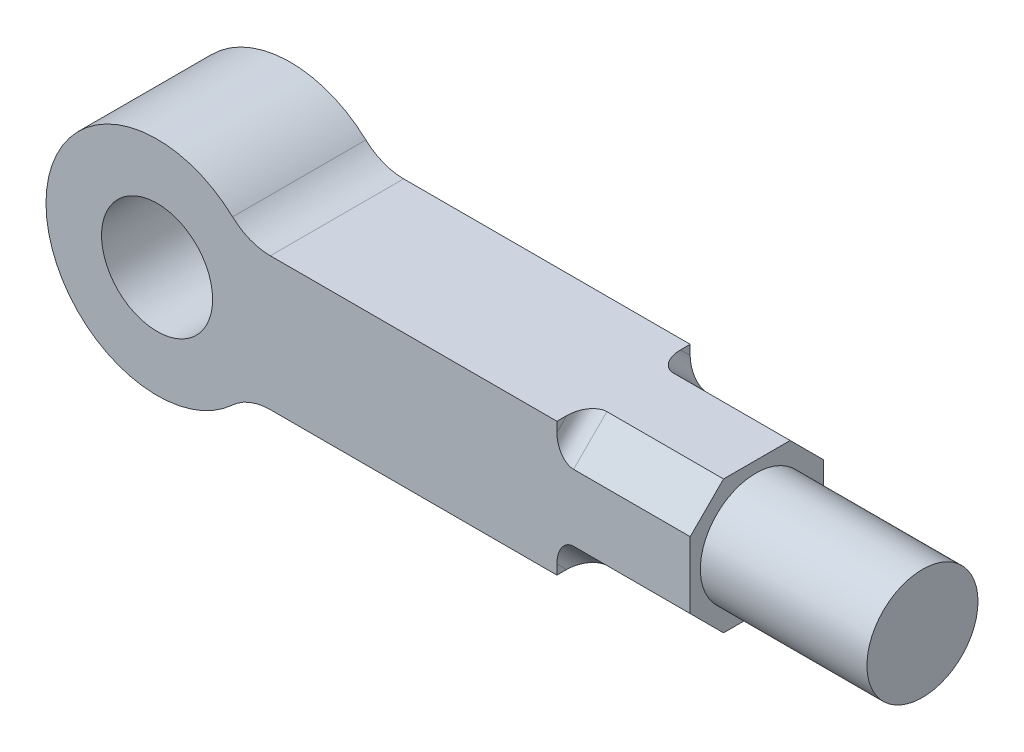
ISO-10303-21;
HEADER;
FILE_DESCRIPTION(('STEP AP214'),'2;1');
FILE_NAME('part.step','',(''),(''),'','','');
FILE_SCHEMA(('AUTOMOTIVE_DESIGN { 1 0 10303 214 1 1 1 1 }'));
ENDSEC;
DATA;
#1=APPLICATION_CONTEXT('core data for automotive mechanical design processes');
#2=APPLICATION_PROTOCOL_DEFINITION('international standard','automotive_design',2000,#1);
#3=PRODUCT_CONTEXT('',#1,'mechanical');
#4=PRODUCT('Part','Part','',(#3));
#5=PRODUCT_RELATED_PRODUCT_CATEGORY('part','',(#4));
#6=PRODUCT_DEFINITION_FORMATION('','',#4);
#7=PRODUCT_DEFINITION_CONTEXT('part definition',#1,'design');
#8=PRODUCT_DEFINITION('design','',#6,#7);
#9=PRODUCT_DEFINITION_SHAPE('','',#8);
#10=(LENGTH_UNIT() NAMED_UNIT(*) SI_UNIT(.MILLI.,.METRE.));
#11=(NAMED_UNIT(*) PLANE_ANGLE_UNIT() SI_UNIT($,.RADIAN.));
#12=(NAMED_UNIT(*) SI_UNIT($,.STERADIAN.) SOLID_ANGLE_UNIT());
#13=UNCERTAINTY_MEASURE_WITH_UNIT(LENGTH_MEASURE(1.E-05),#10,'distance_accuracy_value','');
#14=(GEOMETRIC_REPRESENTATION_CONTEXT(3) GLOBAL_UNCERTAINTY_ASSIGNED_CONTEXT((#13)) GLOBAL_UNIT_ASSIGNED_CONTEXT((#10,
#11,#12)) REPRESENTATION_CONTEXT('',''));
#15=CARTESIAN_POINT('',(0.,0.,0.));
#16=DIRECTION('',(0.,0.,1.));
#17=DIRECTION('',(1.,0.,0.));
#18=AXIS2_PLACEMENT_3D('',#15,#16,#17);
#19=CARTESIAN_POINT('',(20.3960780543711,-22.,0.));
#20=DIRECTION('',(0.,0.,-1.));
#21=DIRECTION('',(-1.,0.,0.));
#22=AXIS2_PLACEMENT_3D('',#19,#20,#21);
#23=PLANE('',#22);
#24=DIRECTION('',(0.,1.,0.));
#25=VECTOR('',#24,1.);
#26=CARTESIAN_POINT('',(72.,0.,0.));
#27=LINE('',#26,#25);
#28=CARTESIAN_POINT('',(72.,10.2426406871193,0.));
#29=VERTEX_POINT('',#28);
#30=CARTESIAN_POINT('',(72.,12.,0.));
#31=VERTEX_POINT('',#30);
#32=EDGE_CURVE('E360',#29,#31,#27,.T.);
#33=ORIENTED_EDGE('',*,*,#32,.F.);
#34=CARTESIAN_POINT('',(75.,10.2426406871193,0.));
#35=DIRECTION('',(0.,0.,-1.));
#36=DIRECTION('',(0.,-1.,0.));
#37=AXIS2_PLACEMENT_3D('',#34,#35,#36);
#38=ELLIPSE('',#37,4.24264068711928,3.);
#39=CARTESIAN_POINT('',(75.,6.00000000000001,0.));
#40=VERTEX_POINT('',#39);
#41=EDGE_CURVE('E56',#29,#40,#38,.F.);
#42=ORIENTED_EDGE('',*,*,#41,.T.);
#43=DIRECTION('',(1.,0.,0.));
#44=VECTOR('',#43,1.);
#45=CARTESIAN_POINT('',(72.,6.00000000000001,0.));
#46=LINE('',#45,#44);
#47=CARTESIAN_POINT('',(96.,6.00000000000001,0.));
#48=VERTEX_POINT('',#47);
#49=EDGE_CURVE('E383',#40,#48,#46,.T.);
#50=ORIENTED_EDGE('',*,*,#49,.T.);
#51=DIRECTION('',(0.,1.,0.));
#52=VECTOR('',#51,1.);
#53=CARTESIAN_POINT('',(96.,12.,0.));
#54=LINE('',#53,#52);
#55=CARTESIAN_POINT('',(96.,-6.00000000000001,0.));
#56=VERTEX_POINT('',#55);
#57=EDGE_CURVE('E331',#56,#48,#54,.T.);
#58=ORIENTED_EDGE('',*,*,#57,.F.);
#59=DIRECTION('',(1.,0.,0.));
#60=VECTOR('',#59,1.);
#61=CARTESIAN_POINT('',(72.,-6.00000000000001,0.));
#62=LINE('',#61,#60);
#63=CARTESIAN_POINT('',(75.,-6.00000000000001,0.));
#64=VERTEX_POINT('',#63);
#65=EDGE_CURVE('E401',#64,#56,#62,.T.);
#66=ORIENTED_EDGE('',*,*,#65,.F.);
#67=CARTESIAN_POINT('',(75.,-10.3881066520916,0.));
#68=DIRECTION('',(0.,0.,-1.));
#69=DIRECTION('',(0.,-1.,0.));
#70=AXIS2_PLACEMENT_3D('',#67,#68,#69);
#71=ELLIPSE('',#70,4.38810665209159,3.);
#72=CARTESIAN_POINT('',(72.,-10.3881066520916,0.));
#73=VERTEX_POINT('',#72);
#74=EDGE_CURVE('E188',#64,#73,#71,.F.);
#75=ORIENTED_EDGE('',*,*,#74,.T.);
#76=DIRECTION('',(0.,1.,0.));
#77=VECTOR('',#76,1.);
#78=CARTESIAN_POINT('',(72.,0.,0.));
#79=LINE('',#78,#77);
#80=CARTESIAN_POINT('',(72.,-12.,0.));
#81=VERTEX_POINT('',#80);
#82=EDGE_CURVE('E174',#81,#73,#79,.T.);
#83=ORIENTED_EDGE('',*,*,#82,.F.);
#84=DIRECTION('',(1.,0.,0.));
#85=VECTOR('',#84,1.);
#86=CARTESIAN_POINT('',(20.3960780543711,-12.,0.));
#87=LINE('',#86,#85);
#88=CARTESIAN_POINT('',(20.3960780543711,-12.,0.));
#89=VERTEX_POINT('',#88);
#90=EDGE_CURVE('E186',#89,#81,#87,.T.);
#91=ORIENTED_EDGE('',*,*,#90,.F.);
#92=CARTESIAN_POINT('',(20.3960780543711,-22.,0.));
#93=DIRECTION('',(0.,0.,-1.));
#94=DIRECTION('',(-1.,0.,0.));
#95=AXIS2_PLACEMENT_3D('',#92,#93,#94);
#96=CIRCLE('',#95,10.);
#97=CARTESIAN_POINT('',(13.5973853695808,-14.6666666666667,0.));
#98=VERTEX_POINT('',#97);
#99=EDGE_CURVE('E200',#98,#89,#96,.T.);
#100=ORIENTED_EDGE('',*,*,#99,.F.);
#101=CARTESIAN_POINT('',(0.,0.,0.));
#102=DIRECTION('',(0.,0.,1.));
#103=DIRECTION('',(1.,0.,0.));
#104=AXIS2_PLACEMENT_3D('',#101,#102,#103);
#105=CIRCLE('',#104,20.);
#106=CARTESIAN_POINT('',(13.5973853695807,14.6666666666667,0.));
#107=VERTEX_POINT('',#106);
#108=EDGE_CURVE('E208',#107,#98,#105,.T.);
#109=ORIENTED_EDGE('',*,*,#108,.F.);
#110=CARTESIAN_POINT('',(20.3960780543711,22.,0.));
#111=DIRECTION('',(0.,0.,-1.));
#112=DIRECTION('',(-1.,0.,0.));
#113=AXIS2_PLACEMENT_3D('',#110,#111,#112);
#114=CIRCLE('',#113,10.);
#115=CARTESIAN_POINT('',(20.3960780543711,12.,0.));
#116=VERTEX_POINT('',#115);
#117=EDGE_CURVE('E339',#116,#107,#114,.T.);
#118=ORIENTED_EDGE('',*,*,#117,.F.);
#119=DIRECTION('',(-1.,0.,0.));
#120=VECTOR('',#119,1.);
#121=CARTESIAN_POINT('',(20.3960780543711,12.,0.));
#122=LINE('',#121,#120);
#123=EDGE_CURVE('E335',#31,#116,#122,.T.);
#124=ORIENTED_EDGE('',*,*,#123,.F.);
#125=EDGE_LOOP('',(#33,#42,#50,#58,#66,#75,#83,#91,#100,#109,#118,#124));
#126=FACE_BOUND('',#125,.T.);
#127=CARTESIAN_POINT('',(0.,0.,0.));
#128=DIRECTION('',(0.,0.,1.));
#129=DIRECTION('',(1.,0.,0.));
#130=AXIS2_PLACEMENT_3D('',#127,#128,#129);
#131=CIRCLE('',#130,10.);
#132=CARTESIAN_POINT('',(10.,0.,0.));
#133=VERTEX_POINT('',#132);
#134=EDGE_CURVE('E420',#133,#133,#131,.T.);
#135=ORIENTED_EDGE('',*,*,#134,.T.);
#136=EDGE_LOOP('',(#135));
#137=FACE_BOUND('',#136,.T.);
#138=ADVANCED_FACE('F47',(#126,#137),#23,.T.);
#139=CARTESIAN_POINT('',(96.,12.,24.));
#140=DIRECTION('',(-1.,0.,0.));
#141=DIRECTION('',(0.,0.,1.));
#142=AXIS2_PLACEMENT_3D('',#139,#140,#141);
#143=PLANE('',#142);
#144=CARTESIAN_POINT('',(96.,0.,12.1791365862407));
#145=DIRECTION('',(1.,0.,0.));
#146=DIRECTION('',(0.,0.,-1.));
#147=AXIS2_PLACEMENT_3D('',#144,#145,#146);
#148=CIRCLE('',#147,10.);
#149=CARTESIAN_POINT('',(96.,0.,2.1791365862407));
#150=VERTEX_POINT('',#149);
#151=EDGE_CURVE('E235',#150,#150,#148,.T.);
#152=ORIENTED_EDGE('',*,*,#151,.F.);
#153=EDGE_LOOP('',(#152));
#154=FACE_BOUND('',#153,.T.);
#155=ORIENTED_EDGE('',*,*,#57,.T.);
#156=DIRECTION('',(0.,-0.707106781186548,-0.707106781186548));
#157=VECTOR('',#156,1.);
#158=CARTESIAN_POINT('',(96.,3.,-3.));
#159=LINE('',#158,#157);
#160=CARTESIAN_POINT('',(96.,12.,6.00000000000001));
#161=VERTEX_POINT('',#160);
#162=EDGE_CURVE('E370',#161,#48,#159,.T.);
#163=ORIENTED_EDGE('',*,*,#162,.F.);
#164=DIRECTION('',(0.,0.,-1.));
#165=VECTOR('',#164,1.);
#166=CARTESIAN_POINT('',(96.,12.,24.));
#167=LINE('',#166,#165);
#168=CARTESIAN_POINT('',(96.,12.,18.));
#169=VERTEX_POINT('',#168);
#170=EDGE_CURVE('E231',#169,#161,#167,.T.);
#171=ORIENTED_EDGE('',*,*,#170,.F.);
#172=DIRECTION('',(0.,0.707106781186548,-0.707106781186547));
#173=VECTOR('',#172,1.);
#174=CARTESIAN_POINT('',(96.,15.,15.));
#175=LINE('',#174,#173);
#176=CARTESIAN_POINT('',(96.,6.00000000000001,24.));
#177=VERTEX_POINT('',#176);
#178=EDGE_CURVE('E386',#177,#169,#175,.T.);
#179=ORIENTED_EDGE('',*,*,#178,.F.);
#180=DIRECTION('',(0.,1.,0.));
#181=VECTOR('',#180,1.);
#182=CARTESIAN_POINT('',(96.,12.,24.));
#183=LINE('',#182,#181);
#184=CARTESIAN_POINT('',(96.,-6.00000000000001,24.));
#185=VERTEX_POINT('',#184);
#186=EDGE_CURVE('E199',#185,#177,#183,.T.);
#187=ORIENTED_EDGE('',*,*,#186,.F.);
#188=DIRECTION('',(0.,0.707106781186547,0.707106781186548));
#189=VECTOR('',#188,1.);
#190=CARTESIAN_POINT('',(96.,-15.,15.));
#191=LINE('',#190,#189);
#192=CARTESIAN_POINT('',(96.,-12.,18.));
#193=VERTEX_POINT('',#192);
#194=EDGE_CURVE('E394',#193,#185,#191,.T.);
#195=ORIENTED_EDGE('',*,*,#194,.F.);
#196=DIRECTION('',(0.,0.,-1.));
#197=VECTOR('',#196,1.);
#198=CARTESIAN_POINT('',(96.,-12.,24.));
#199=LINE('',#198,#197);
#200=CARTESIAN_POINT('',(96.,-12.,5.62075310819665));
#201=VERTEX_POINT('',#200);
#202=EDGE_CURVE('E212',#193,#201,#199,.T.);
#203=ORIENTED_EDGE('',*,*,#202,.T.);
#204=DIRECTION('',(0.,0.729794895369163,-0.683666154415379));
#205=VECTOR('',#204,1.);
#206=CARTESIAN_POINT('',(96.,-2.80439646415868,-2.99361641777407));
#207=LINE('',#206,#205);
#208=EDGE_CURVE('E181',#201,#56,#207,.T.);
#209=ORIENTED_EDGE('',*,*,#208,.T.);
#210=EDGE_LOOP('',(#155,#163,#171,#179,#187,#195,#203,#209));
#211=FACE_BOUND('',#210,.T.);
#212=ADVANCED_FACE('F445',(#154,#211),#143,.F.);
#213=CARTESIAN_POINT('',(20.3960780543711,-12.,24.));
#214=DIRECTION('',(0.,1.,0.));
#215=DIRECTION('',(0.,0.,1.));
#216=AXIS2_PLACEMENT_3D('',#213,#214,#215);
#217=PLANE('',#216);
#218=ORIENTED_EDGE('',*,*,#202,.F.);
#219=DIRECTION('',(1.,0.,0.));
#220=VECTOR('',#219,1.);
#221=CARTESIAN_POINT('',(72.,-12.,18.));
#222=LINE('',#221,#220);
#223=CARTESIAN_POINT('',(75.,-12.,18.));
#224=VERTEX_POINT('',#223);
#225=EDGE_CURVE('E397',#224,#193,#222,.T.);
#226=ORIENTED_EDGE('',*,*,#225,.F.);
#227=CARTESIAN_POINT('',(75.,-12.,22.2426406871193));
#228=DIRECTION('',(0.,1.,0.));
#229=DIRECTION('',(0.,0.,1.));
#230=AXIS2_PLACEMENT_3D('',#227,#228,#229);
#231=ELLIPSE('',#230,4.24264068711929,3.);
#232=CARTESIAN_POINT('',(72.,-12.,22.2426406871193));
#233=VERTEX_POINT('',#232);
#234=EDGE_CURVE('E270',#224,#233,#231,.T.);
#235=ORIENTED_EDGE('',*,*,#234,.T.);
#236=DIRECTION('',(0.,0.,-1.));
#237=VECTOR('',#236,1.);
#238=CARTESIAN_POINT('',(72.,-12.,0.));
#239=LINE('',#238,#237);
#240=CARTESIAN_POINT('',(72.,-12.,24.));
#241=VERTEX_POINT('',#240);
#242=EDGE_CURVE('E389',#241,#233,#239,.T.);
#243=ORIENTED_EDGE('',*,*,#242,.F.);
#244=DIRECTION('',(1.,0.,0.));
#245=VECTOR('',#244,1.);
#246=CARTESIAN_POINT('',(20.3960780543711,-12.,24.));
#247=LINE('',#246,#245);
#248=CARTESIAN_POINT('',(20.3960780543711,-12.,24.));
#249=VERTEX_POINT('',#248);
#250=EDGE_CURVE('E216',#249,#241,#247,.T.);
#251=ORIENTED_EDGE('',*,*,#250,.F.);
#252=DIRECTION('',(0.,0.,-1.));
#253=VECTOR('',#252,1.);
#254=CARTESIAN_POINT('',(20.3960780543711,-12.,24.));
#255=LINE('',#254,#253);
#256=EDGE_CURVE('E197',#249,#89,#255,.T.);
#257=ORIENTED_EDGE('',*,*,#256,.T.);
#258=ORIENTED_EDGE('',*,*,#90,.T.);
#259=DIRECTION('',(0.,0.,-1.));
#260=VECTOR('',#259,1.);
#261=CARTESIAN_POINT('',(72.,-12.,0.));
#262=LINE('',#261,#260);
#263=CARTESIAN_POINT('',(72.,-12.,1.51000909088961));
#264=VERTEX_POINT('',#263);
#265=EDGE_CURVE('E171',#264,#81,#262,.T.);
#266=ORIENTED_EDGE('',*,*,#265,.F.);
#267=CARTESIAN_POINT('',(75.,-12.,1.51000909088961));
#268=DIRECTION('',(0.,1.,0.));
#269=DIRECTION('',(0.,0.,1.));
#270=AXIS2_PLACEMENT_3D('',#267,#268,#269);
#271=ELLIPSE('',#270,4.11074401730704,3.);
#272=CARTESIAN_POINT('',(75.,-12.,5.62075310819665));
#273=VERTEX_POINT('',#272);
#274=EDGE_CURVE('E264',#264,#273,#271,.T.);
#275=ORIENTED_EDGE('',*,*,#274,.T.);
#276=DIRECTION('',(1.,0.,0.));
#277=VECTOR('',#276,1.);
#278=CARTESIAN_POINT('',(72.,-12.,5.62075310819665));
#279=LINE('',#278,#277);
#280=EDGE_CURVE('E190',#273,#201,#279,.T.);
#281=ORIENTED_EDGE('',*,*,#280,.T.);
#282=EDGE_LOOP('',(#218,#226,#235,#243,#251,#257,#258,#266,#275,#281));
#283=FACE_BOUND('',#282,.T.);
#284=ADVANCED_FACE('F194',(#283),#217,.F.);
#285=CARTESIAN_POINT('',(20.3960780543711,-22.,24.));
#286=DIRECTION('',(0.,0.,-1.));
#287=DIRECTION('',(-1.,0.,0.));
#288=AXIS2_PLACEMENT_3D('',#285,#286,#287);
#289=PLANE('',#288);
#290=DIRECTION('',(0.,-1.,0.));
#291=VECTOR('',#290,1.);
#292=CARTESIAN_POINT('',(72.,0.,24.));
#293=LINE('',#292,#291);
#294=CARTESIAN_POINT('',(72.,-10.2426406871193,24.));
#295=VERTEX_POINT('',#294);
#296=EDGE_CURVE('E393',#295,#241,#293,.T.);
#297=ORIENTED_EDGE('',*,*,#296,.F.);
#298=CARTESIAN_POINT('',(75.,-10.2426406871193,24.));
#299=DIRECTION('',(0.,0.,-1.));
#300=DIRECTION('',(0.,1.,0.));
#301=AXIS2_PLACEMENT_3D('',#298,#299,#300);
#302=ELLIPSE('',#301,4.24264068711928,3.);
#303=CARTESIAN_POINT('',(75.,-6.00000000000001,24.));
#304=VERTEX_POINT('',#303);
#305=EDGE_CURVE('E267',#295,#304,#302,.T.);
#306=ORIENTED_EDGE('',*,*,#305,.T.);
#307=DIRECTION('',(1.,0.,0.));
#308=VECTOR('',#307,1.);
#309=CARTESIAN_POINT('',(72.,-6.00000000000001,24.));
#310=LINE('',#309,#308);
#311=EDGE_CURVE('E378',#304,#185,#310,.T.);
#312=ORIENTED_EDGE('',*,*,#311,.T.);
#313=ORIENTED_EDGE('',*,*,#186,.T.);
#314=DIRECTION('',(1.,0.,0.));
#315=VECTOR('',#314,1.);
#316=CARTESIAN_POINT('',(72.,6.00000000000001,24.));
#317=LINE('',#316,#315);
#318=CARTESIAN_POINT('',(75.,6.00000000000001,24.));
#319=VERTEX_POINT('',#318);
#320=EDGE_CURVE('E413',#319,#177,#317,.T.);
#321=ORIENTED_EDGE('',*,*,#320,.F.);
#322=CARTESIAN_POINT('',(75.,10.2426406871193,24.));
#323=DIRECTION('',(0.,0.,-1.));
#324=DIRECTION('',(0.,1.,0.));
#325=AXIS2_PLACEMENT_3D('',#322,#323,#324);
#326=ELLIPSE('',#325,4.24264068711929,3.);
#327=CARTESIAN_POINT('',(72.,10.2426406871193,24.));
#328=VERTEX_POINT('',#327);
#329=EDGE_CURVE('E276',#319,#328,#326,.T.);
#330=ORIENTED_EDGE('',*,*,#329,.T.);
#331=DIRECTION('',(0.,-1.,0.));
#332=VECTOR('',#331,1.);
#333=CARTESIAN_POINT('',(72.,0.,24.));
#334=LINE('',#333,#332);
#335=CARTESIAN_POINT('',(72.,12.,24.));
#336=VERTEX_POINT('',#335);
#337=EDGE_CURVE('E406',#336,#328,#334,.T.);
#338=ORIENTED_EDGE('',*,*,#337,.F.);
#339=DIRECTION('',(-1.,0.,0.));
#340=VECTOR('',#339,1.);
#341=CARTESIAN_POINT('',(20.3960780543711,12.,24.));
#342=LINE('',#341,#340);
#343=CARTESIAN_POINT('',(20.3960780543711,12.,24.));
#344=VERTEX_POINT('',#343);
#345=EDGE_CURVE('E206',#336,#344,#342,.T.);
#346=ORIENTED_EDGE('',*,*,#345,.T.);
#347=CARTESIAN_POINT('',(20.3960780543711,22.,24.));
#348=DIRECTION('',(0.,0.,-1.));
#349=DIRECTION('',(-1.,0.,0.));
#350=AXIS2_PLACEMENT_3D('',#347,#348,#349);
#351=CIRCLE('',#350,10.);
#352=CARTESIAN_POINT('',(13.5973853695807,14.6666666666667,24.));
#353=VERTEX_POINT('',#352);
#354=EDGE_CURVE('E317',#344,#353,#351,.T.);
#355=ORIENTED_EDGE('',*,*,#354,.T.);
#356=CARTESIAN_POINT('',(0.,0.,24.));
#357=DIRECTION('',(0.,0.,1.));
#358=DIRECTION('',(1.,0.,0.));
#359=AXIS2_PLACEMENT_3D('',#356,#357,#358);
#360=CIRCLE('',#359,20.);
#361=CARTESIAN_POINT('',(13.5973853695808,-14.6666666666667,24.));
#362=VERTEX_POINT('',#361);
#363=EDGE_CURVE('E313',#353,#362,#360,.T.);
#364=ORIENTED_EDGE('',*,*,#363,.T.);
#365=CARTESIAN_POINT('',(20.3960780543711,-22.,24.));
#366=DIRECTION('',(0.,0.,-1.));
#367=DIRECTION('',(-1.,0.,0.));
#368=AXIS2_PLACEMENT_3D('',#365,#366,#367);
#369=CIRCLE('',#368,10.);
#370=EDGE_CURVE('E309',#362,#249,#369,.T.);
#371=ORIENTED_EDGE('',*,*,#370,.T.);
#372=ORIENTED_EDGE('',*,*,#250,.T.);
#373=EDGE_LOOP('',(#297,#306,#312,#313,#321,#330,#338,#346,#355,#364,#371,#372));
#374=FACE_BOUND('',#373,.T.);
#375=CARTESIAN_POINT('',(0.,0.,24.));
#376=DIRECTION('',(0.,0.,1.));
#377=DIRECTION('',(1.,0.,0.));
#378=AXIS2_PLACEMENT_3D('',#375,#376,#377);
#379=CIRCLE('',#378,10.);
#380=CARTESIAN_POINT('',(10.,0.,24.));
#381=VERTEX_POINT('',#380);
#382=EDGE_CURVE('E336',#381,#381,#379,.T.);
#383=ORIENTED_EDGE('',*,*,#382,.F.);
#384=EDGE_LOOP('',(#383));
#385=FACE_BOUND('',#384,.T.);
#386=ADVANCED_FACE('F354',(#374,#385),#289,.F.);
#387=CARTESIAN_POINT('',(20.3960780543711,12.,24.));
#388=DIRECTION('',(0.,-1.,0.));
#389=DIRECTION('',(0.,0.,-1.));
#390=AXIS2_PLACEMENT_3D('',#387,#388,#389);
#391=PLANE('',#390);
#392=ORIENTED_EDGE('',*,*,#170,.T.);
#393=DIRECTION('',(1.,0.,0.));
#394=VECTOR('',#393,1.);
#395=CARTESIAN_POINT('',(72.,12.,6.00000000000001));
#396=LINE('',#395,#394);
#397=CARTESIAN_POINT('',(75.,12.,6.00000000000001));
#398=VERTEX_POINT('',#397);
#399=EDGE_CURVE('E375',#398,#161,#396,.T.);
#400=ORIENTED_EDGE('',*,*,#399,.F.);
#401=CARTESIAN_POINT('',(75.,12.,1.75735931288071));
#402=DIRECTION('',(0.,-1.,0.));
#403=DIRECTION('',(0.,0.,-1.));
#404=AXIS2_PLACEMENT_3D('',#401,#402,#403);
#405=ELLIPSE('',#404,4.24264068711928,3.);
#406=CARTESIAN_POINT('',(72.,12.,1.75735931288071));
#407=VERTEX_POINT('',#406);
#408=EDGE_CURVE('E11',#398,#407,#405,.T.);
#409=ORIENTED_EDGE('',*,*,#408,.T.);
#410=DIRECTION('',(0.,0.,1.));
#411=VECTOR('',#410,1.);
#412=CARTESIAN_POINT('',(72.,12.,0.));
#413=LINE('',#412,#411);
#414=EDGE_CURVE('E365',#31,#407,#413,.T.);
#415=ORIENTED_EDGE('',*,*,#414,.F.);
#416=ORIENTED_EDGE('',*,*,#123,.T.);
#417=DIRECTION('',(0.,0.,-1.));
#418=VECTOR('',#417,1.);
#419=CARTESIAN_POINT('',(20.3960780543711,12.,24.));
#420=LINE('',#419,#418);
#421=EDGE_CURVE('E227',#344,#116,#420,.T.);
#422=ORIENTED_EDGE('',*,*,#421,.F.);
#423=ORIENTED_EDGE('',*,*,#345,.F.);
#424=DIRECTION('',(0.,0.,1.));
#425=VECTOR('',#424,1.);
#426=CARTESIAN_POINT('',(72.,12.,0.));
#427=LINE('',#426,#425);
#428=CARTESIAN_POINT('',(72.,12.,22.2426406871193));
#429=VERTEX_POINT('',#428);
#430=EDGE_CURVE('E410',#429,#336,#427,.T.);
#431=ORIENTED_EDGE('',*,*,#430,.F.);
#432=CARTESIAN_POINT('',(75.,12.,22.2426406871193));
#433=DIRECTION('',(0.,-1.,0.));
#434=DIRECTION('',(0.,0.,-1.));
#435=AXIS2_PLACEMENT_3D('',#432,#433,#434);
#436=ELLIPSE('',#435,4.24264068711928,3.);
#437=CARTESIAN_POINT('',(75.,12.,18.));
#438=VERTEX_POINT('',#437);
#439=EDGE_CURVE('E273',#429,#438,#436,.T.);
#440=ORIENTED_EDGE('',*,*,#439,.T.);
#441=DIRECTION('',(1.,0.,0.));
#442=VECTOR('',#441,1.);
#443=CARTESIAN_POINT('',(72.,12.,18.));
#444=LINE('',#443,#442);
#445=EDGE_CURVE('E417',#438,#169,#444,.T.);
#446=ORIENTED_EDGE('',*,*,#445,.T.);
#447=EDGE_LOOP('',(#392,#400,#409,#415,#416,#422,#423,#431,#440,#446));
#448=FACE_BOUND('',#447,.T.);
#449=ADVANCED_FACE('F363',(#448),#391,.F.);
#450=CARTESIAN_POINT('',(20.3960780543711,22.,24.));
#451=DIRECTION('',(0.,0.,-1.));
#452=DIRECTION('',(-1.,0.,0.));
#453=AXIS2_PLACEMENT_3D('',#450,#451,#452);
#454=CYLINDRICAL_SURFACE('',#453,10.);
#455=ORIENTED_EDGE('',*,*,#117,.T.);
#456=DIRECTION('',(0.,0.,-1.));
#457=VECTOR('',#456,1.);
#458=CARTESIAN_POINT('',(13.5973853695807,14.6666666666667,24.));
#459=LINE('',#458,#457);
#460=EDGE_CURVE('E223',#353,#107,#459,.T.);
#461=ORIENTED_EDGE('',*,*,#460,.F.);
#462=ORIENTED_EDGE('',*,*,#354,.F.);
#463=ORIENTED_EDGE('',*,*,#421,.T.);
#464=EDGE_LOOP('',(#455,#461,#462,#463));
#465=FACE_BOUND('',#464,.T.);
#466=ADVANCED_FACE('F358',(#465),#454,.F.);
#467=CARTESIAN_POINT('',(0.,0.,24.));
#468=DIRECTION('',(0.,0.,-1.));
#469=DIRECTION('',(-1.,0.,0.));
#470=AXIS2_PLACEMENT_3D('',#467,#468,#469);
#471=CYLINDRICAL_SURFACE('',#470,20.);
#472=ORIENTED_EDGE('',*,*,#108,.T.);
#473=DIRECTION('',(0.,0.,-1.));
#474=VECTOR('',#473,1.);
#475=CARTESIAN_POINT('',(13.5973853695808,-14.6666666666667,24.));
#476=LINE('',#475,#474);
#477=EDGE_CURVE('E219',#362,#98,#476,.T.);
#478=ORIENTED_EDGE('',*,*,#477,.F.);
#479=ORIENTED_EDGE('',*,*,#363,.F.);
#480=ORIENTED_EDGE('',*,*,#460,.T.);
#481=EDGE_LOOP('',(#472,#478,#479,#480));
#482=FACE_BOUND('',#481,.T.);
#483=ADVANCED_FACE('F346',(#482),#471,.T.);
#484=CARTESIAN_POINT('',(20.3960780543711,-22.,24.));
#485=DIRECTION('',(0.,0.,-1.));
#486=DIRECTION('',(-1.,0.,0.));
#487=AXIS2_PLACEMENT_3D('',#484,#485,#486);
#488=CYLINDRICAL_SURFACE('',#487,10.);
#489=ORIENTED_EDGE('',*,*,#99,.T.);
#490=ORIENTED_EDGE('',*,*,#256,.F.);
#491=ORIENTED_EDGE('',*,*,#370,.F.);
#492=ORIENTED_EDGE('',*,*,#477,.T.);
#493=EDGE_LOOP('',(#489,#490,#491,#492));
#494=FACE_BOUND('',#493,.T.);
#495=ADVANCED_FACE('F352',(#494),#488,.F.);
#496=CARTESIAN_POINT('',(0.,0.,24.));
#497=DIRECTION('',(0.,0.,-1.));
#498=DIRECTION('',(-1.,0.,0.));
#499=AXIS2_PLACEMENT_3D('',#496,#497,#498);
#500=CYLINDRICAL_SURFACE('',#499,10.);
#501=ORIENTED_EDGE('',*,*,#382,.T.);
#502=EDGE_LOOP('',(#501));
#503=FACE_BOUND('',#502,.T.);
#504=ORIENTED_EDGE('',*,*,#134,.F.);
#505=EDGE_LOOP('',(#504));
#506=FACE_BOUND('',#505,.T.);
#507=ADVANCED_FACE('F430',(#503,#506),#500,.F.);
#508=CARTESIAN_POINT('',(72.,-2.80439646415868,-2.99361641777407));
#509=DIRECTION('',(0.,-0.683666154415379,-0.729794895369163));
#510=DIRECTION('',(0.,0.729794895369163,-0.683666154415379));
#511=AXIS2_PLACEMENT_3D('',#508,#509,#510);
#512=PLANE('',#511);
#513=ORIENTED_EDGE('',*,*,#280,.F.);
#514=DIRECTION('',(0.,0.729794895369163,-0.683666154415379));
#515=VECTOR('',#514,1.);
#516=CARTESIAN_POINT('',(75.,-6.00000000000001,0.));
#517=LINE('',#516,#515);
#518=EDGE_CURVE('E236',#273,#64,#517,.T.);
#519=ORIENTED_EDGE('',*,*,#518,.T.);
#520=ORIENTED_EDGE('',*,*,#65,.T.);
#521=ORIENTED_EDGE('',*,*,#208,.F.);
#522=EDGE_LOOP('',(#513,#519,#520,#521));
#523=FACE_BOUND('',#522,.T.);
#524=ADVANCED_FACE('F432',(#523),#512,.T.);
#525=CARTESIAN_POINT('',(72.,0.,0.));
#526=DIRECTION('',(1.,0.,0.));
#527=DIRECTION('',(0.,0.,-1.));
#528=AXIS2_PLACEMENT_3D('',#525,#526,#527);
#529=PLANE('',#528);
#530=ORIENTED_EDGE('',*,*,#82,.T.);
#531=DIRECTION('',(0.,0.729794895369163,-0.683666154415379));
#532=VECTOR('',#531,1.);
#533=CARTESIAN_POINT('',(72.,-14.0509984632461,3.43136842208916));
#534=LINE('',#533,#532);
#535=EDGE_CURVE('E176',#73,#264,#534,.F.);
#536=ORIENTED_EDGE('',*,*,#535,.T.);
#537=ORIENTED_EDGE('',*,*,#265,.T.);
#538=EDGE_LOOP('',(#530,#536,#537));
#539=FACE_BOUND('',#538,.T.);
#540=ADVANCED_FACE('F173',(#539),#529,.T.);
#541=CARTESIAN_POINT('',(72.,-15.,15.));
#542=DIRECTION('',(0.,0.707106781186548,-0.707106781186547));
#543=DIRECTION('',(0.,0.707106781186547,0.707106781186548));
#544=AXIS2_PLACEMENT_3D('',#541,#542,#543);
#545=PLANE('',#544);
#546=ORIENTED_EDGE('',*,*,#311,.F.);
#547=DIRECTION('',(0.,0.707106781186547,0.707106781186548));
#548=VECTOR('',#547,1.);
#549=CARTESIAN_POINT('',(75.,-15.,15.));
#550=LINE('',#549,#548);
#551=EDGE_CURVE('E246',#304,#224,#550,.F.);
#552=ORIENTED_EDGE('',*,*,#551,.T.);
#553=ORIENTED_EDGE('',*,*,#225,.T.);
#554=ORIENTED_EDGE('',*,*,#194,.T.);
#555=EDGE_LOOP('',(#546,#552,#553,#554));
#556=FACE_BOUND('',#555,.T.);
#557=ADVANCED_FACE('F508',(#556),#545,.F.);
#558=CARTESIAN_POINT('',(72.,0.,0.));
#559=DIRECTION('',(1.,0.,0.));
#560=DIRECTION('',(0.,0.,-1.));
#561=AXIS2_PLACEMENT_3D('',#558,#559,#560);
#562=PLANE('',#561);
#563=ORIENTED_EDGE('',*,*,#242,.T.);
#564=DIRECTION('',(0.,0.707106781186547,0.707106781186548));
#565=VECTOR('',#564,1.);
#566=CARTESIAN_POINT('',(72.,-17.1213203435596,17.1213203435596));
#567=LINE('',#566,#565);
#568=EDGE_CURVE('E242',#233,#295,#567,.T.);
#569=ORIENTED_EDGE('',*,*,#568,.T.);
#570=ORIENTED_EDGE('',*,*,#296,.T.);
#571=EDGE_LOOP('',(#563,#569,#570));
#572=FACE_BOUND('',#571,.T.);
#573=ADVANCED_FACE('F505',(#572),#562,.T.);
#574=CARTESIAN_POINT('',(72.,15.,15.));
#575=DIRECTION('',(0.,-0.707106781186547,-0.707106781186548));
#576=DIRECTION('',(0.,0.707106781186548,-0.707106781186547));
#577=AXIS2_PLACEMENT_3D('',#574,#575,#576);
#578=PLANE('',#577);
#579=ORIENTED_EDGE('',*,*,#445,.F.);
#580=DIRECTION('',(0.,0.707106781186548,-0.707106781186547));
#581=VECTOR('',#580,1.);
#582=CARTESIAN_POINT('',(75.,15.,15.));
#583=LINE('',#582,#581);
#584=EDGE_CURVE('E253',#438,#319,#583,.F.);
#585=ORIENTED_EDGE('',*,*,#584,.T.);
#586=ORIENTED_EDGE('',*,*,#320,.T.);
#587=ORIENTED_EDGE('',*,*,#178,.T.);
#588=EDGE_LOOP('',(#579,#585,#586,#587));
#589=FACE_BOUND('',#588,.T.);
#590=ADVANCED_FACE('F485',(#589),#578,.F.);
#591=CARTESIAN_POINT('',(72.,0.,0.));
#592=DIRECTION('',(1.,0.,0.));
#593=DIRECTION('',(0.,0.,-1.));
#594=AXIS2_PLACEMENT_3D('',#591,#592,#593);
#595=PLANE('',#594);
#596=ORIENTED_EDGE('',*,*,#337,.T.);
#597=DIRECTION('',(0.,0.707106781186548,-0.707106781186547));
#598=VECTOR('',#597,1.);
#599=CARTESIAN_POINT('',(72.,17.1213203435596,17.1213203435596));
#600=LINE('',#599,#598);
#601=EDGE_CURVE('E249',#328,#429,#600,.T.);
#602=ORIENTED_EDGE('',*,*,#601,.T.);
#603=ORIENTED_EDGE('',*,*,#430,.T.);
#604=EDGE_LOOP('',(#596,#602,#603));
#605=FACE_BOUND('',#604,.T.);
#606=ADVANCED_FACE('F481',(#605),#595,.T.);
#607=CARTESIAN_POINT('',(72.,3.,-3.));
#608=DIRECTION('',(0.,-0.707106781186547,0.707106781186547));
#609=DIRECTION('',(0.,-0.707106781186548,-0.707106781186548));
#610=AXIS2_PLACEMENT_3D('',#607,#608,#609);
#611=PLANE('',#610);
#612=ORIENTED_EDGE('',*,*,#49,.F.);
#613=DIRECTION('',(0.,-0.707106781186548,-0.707106781186548));
#614=VECTOR('',#613,1.);
#615=CARTESIAN_POINT('',(75.,3.,-3.));
#616=LINE('',#615,#614);
#617=EDGE_CURVE('E63',#40,#398,#616,.F.);
#618=ORIENTED_EDGE('',*,*,#617,.T.);
#619=ORIENTED_EDGE('',*,*,#399,.T.);
#620=ORIENTED_EDGE('',*,*,#162,.T.);
#621=EDGE_LOOP('',(#612,#618,#619,#620));
#622=FACE_BOUND('',#621,.T.);
#623=ADVANCED_FACE('F494',(#622),#611,.F.);
#624=CARTESIAN_POINT('',(72.,0.,0.));
#625=DIRECTION('',(1.,0.,0.));
#626=DIRECTION('',(0.,0.,-1.));
#627=AXIS2_PLACEMENT_3D('',#624,#625,#626);
#628=PLANE('',#627);
#629=ORIENTED_EDGE('',*,*,#414,.T.);
#630=DIRECTION('',(0.,-0.707106781186548,-0.707106781186548));
#631=VECTOR('',#630,1.);
#632=CARTESIAN_POINT('',(72.,5.12132034355964,-5.12132034355964));
#633=LINE('',#632,#631);
#634=EDGE_CURVE('E256',#407,#29,#633,.T.);
#635=ORIENTED_EDGE('',*,*,#634,.T.);
#636=ORIENTED_EDGE('',*,*,#32,.T.);
#637=EDGE_LOOP('',(#629,#635,#636));
#638=FACE_BOUND('',#637,.T.);
#639=ADVANCED_FACE('F491',(#638),#628,.T.);
#640=CARTESIAN_POINT('',(126.,0.,12.1791365862407));
#641=DIRECTION('',(-1.,0.,0.));
#642=DIRECTION('',(0.,0.,1.));
#643=AXIS2_PLACEMENT_3D('',#640,#641,#642);
#644=CYLINDRICAL_SURFACE('',#643,10.);
#645=CARTESIAN_POINT('',(126.,0.,12.1791365862407));
#646=DIRECTION('',(1.,0.,0.));
#647=DIRECTION('',(0.,0.,-1.));
#648=AXIS2_PLACEMENT_3D('',#645,#646,#647);
#649=CIRCLE('',#648,10.);
#650=CARTESIAN_POINT('',(126.,0.,2.1791365862407));
#651=VERTEX_POINT('',#650);
#652=EDGE_CURVE('E698',#651,#651,#649,.T.);
#653=ORIENTED_EDGE('',*,*,#652,.F.);
#654=EDGE_LOOP('',(#653));
#655=FACE_BOUND('',#654,.T.);
#656=ORIENTED_EDGE('',*,*,#151,.T.);
#657=EDGE_LOOP('',(#656));
#658=FACE_BOUND('',#657,.T.);
#659=ADVANCED_FACE('F493',(#655,#658),#644,.T.);
#660=CARTESIAN_POINT('',(126.,0.,0.));
#661=DIRECTION('',(1.,0.,0.));
#662=DIRECTION('',(0.,0.,-1.));
#663=AXIS2_PLACEMENT_3D('',#660,#661,#662);
#664=PLANE('',#663);
#665=ORIENTED_EDGE('',*,*,#652,.T.);
#666=EDGE_LOOP('',(#665));
#667=FACE_BOUND('',#666,.T.);
#668=ADVANCED_FACE('F465',(#667),#664,.T.);
#669=CARTESIAN_POINT('',(75.,-4.85539492740482,-5.18300110388154));
#670=DIRECTION('',(0.,-0.729794895369163,0.683666154415379));
#671=DIRECTION('',(0.,-0.683666154415379,-0.729794895369163));
#672=AXIS2_PLACEMENT_3D('',#669,#670,#671);
#673=CYLINDRICAL_SURFACE('',#672,3.);
#674=ORIENTED_EDGE('',*,*,#274,.F.);
#675=ORIENTED_EDGE('',*,*,#535,.F.);
#676=ORIENTED_EDGE('',*,*,#74,.F.);
#677=ORIENTED_EDGE('',*,*,#518,.F.);
#678=EDGE_LOOP('',(#674,#675,#676,#677));
#679=FACE_BOUND('',#678,.T.);
#680=ADVANCED_FACE('F461',(#679),#673,.F.);
#681=CARTESIAN_POINT('',(75.,-17.1213203435596,17.1213203435596));
#682=DIRECTION('',(0.,0.707106781186547,0.707106781186548));
#683=DIRECTION('',(0.,-0.707106781186548,0.707106781186547));
#684=AXIS2_PLACEMENT_3D('',#681,#682,#683);
#685=CYLINDRICAL_SURFACE('',#684,3.);
#686=ORIENTED_EDGE('',*,*,#234,.F.);
#687=ORIENTED_EDGE('',*,*,#551,.F.);
#688=ORIENTED_EDGE('',*,*,#305,.F.);
#689=ORIENTED_EDGE('',*,*,#568,.F.);
#690=EDGE_LOOP('',(#686,#687,#688,#689));
#691=FACE_BOUND('',#690,.T.);
#692=ADVANCED_FACE('F464',(#691),#685,.F.);
#693=CARTESIAN_POINT('',(75.,17.1213203435596,17.1213203435596));
#694=DIRECTION('',(0.,0.707106781186548,-0.707106781186547));
#695=DIRECTION('',(0.,0.707106781186547,0.707106781186548));
#696=AXIS2_PLACEMENT_3D('',#693,#694,#695);
#697=CYLINDRICAL_SURFACE('',#696,3.);
#698=ORIENTED_EDGE('',*,*,#329,.F.);
#699=ORIENTED_EDGE('',*,*,#584,.F.);
#700=ORIENTED_EDGE('',*,*,#439,.F.);
#701=ORIENTED_EDGE('',*,*,#601,.F.);
#702=EDGE_LOOP('',(#698,#699,#700,#701));
#703=FACE_BOUND('',#702,.T.);
#704=ADVANCED_FACE('F468',(#703),#697,.F.);
#705=CARTESIAN_POINT('',(75.,5.12132034355964,-5.12132034355964));
#706=DIRECTION('',(0.,-0.707106781186548,-0.707106781186548));
#707=DIRECTION('',(0.,0.707106781186548,-0.707106781186548));
#708=AXIS2_PLACEMENT_3D('',#705,#706,#707);
#709=CYLINDRICAL_SURFACE('',#708,3.);
#710=ORIENTED_EDGE('',*,*,#408,.F.);
#711=ORIENTED_EDGE('',*,*,#617,.F.);
#712=ORIENTED_EDGE('',*,*,#41,.F.);
#713=ORIENTED_EDGE('',*,*,#634,.F.);
#714=EDGE_LOOP('',(#710,#711,#712,#713));
#715=FACE_BOUND('',#714,.T.);
#716=ADVANCED_FACE('F49',(#715),#709,.F.);
#717=CLOSED_SHELL('',(#138,#212,#284,#386,#449,#466,#483,#495,#507,#524,#540,#557,#573,#590,
#606,#623,#639,#659,#668,#680,#692,#704,#716));
#718=MANIFOLD_SOLID_BREP('B2',#717);
#719=ADVANCED_BREP_SHAPE_REPRESENTATION('',(#18,#718),#14);
#720=SHAPE_DEFINITION_REPRESENTATION(#9,#719);
ENDSEC;
END-ISO-10303-21;
